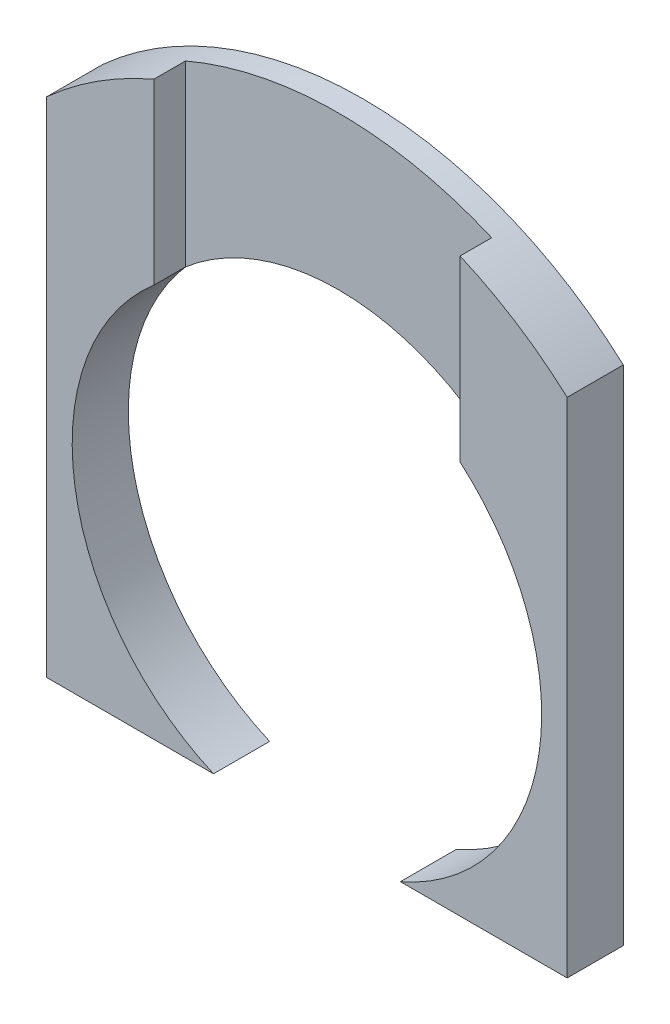
ISO-10303-21;
HEADER;
FILE_DESCRIPTION(('STEP AP214'),'2;1');
FILE_NAME('part.step','',(''),(''),'','','');
FILE_SCHEMA(('AUTOMOTIVE_DESIGN { 1 0 10303 214 1 1 1 1 }'));
ENDSEC;
DATA;
#1=APPLICATION_CONTEXT('core data for automotive mechanical design processes');
#2=APPLICATION_PROTOCOL_DEFINITION('international standard','automotive_design',2000,#1);
#3=PRODUCT_CONTEXT('',#1,'mechanical');
#4=PRODUCT('Part','Part','',(#3));
#5=PRODUCT_RELATED_PRODUCT_CATEGORY('part','',(#4));
#6=PRODUCT_DEFINITION_FORMATION('','',#4);
#7=PRODUCT_DEFINITION_CONTEXT('part definition',#1,'design');
#8=PRODUCT_DEFINITION('design','',#6,#7);
#9=PRODUCT_DEFINITION_SHAPE('','',#8);
#10=(LENGTH_UNIT() NAMED_UNIT(*) SI_UNIT(.MILLI.,.METRE.));
#11=(NAMED_UNIT(*) PLANE_ANGLE_UNIT() SI_UNIT($,.RADIAN.));
#12=(NAMED_UNIT(*) SI_UNIT($,.STERADIAN.) SOLID_ANGLE_UNIT());
#13=UNCERTAINTY_MEASURE_WITH_UNIT(LENGTH_MEASURE(1.E-05),#10,'distance_accuracy_value','');
#14=(GEOMETRIC_REPRESENTATION_CONTEXT(3) GLOBAL_UNCERTAINTY_ASSIGNED_CONTEXT((#13)) GLOBAL_UNIT_ASSIGNED_CONTEXT((#10,
#11,#12)) REPRESENTATION_CONTEXT('',''));
#15=CARTESIAN_POINT('',(0.,0.,0.));
#16=DIRECTION('',(0.,0.,1.));
#17=DIRECTION('',(1.,0.,0.));
#18=AXIS2_PLACEMENT_3D('',#15,#16,#17);
#19=CARTESIAN_POINT('',(0.,0.,32.85));
#20=DIRECTION('',(0.,0.,1.));
#21=DIRECTION('',(1.,0.,0.));
#22=AXIS2_PLACEMENT_3D('',#19,#20,#21);
#23=PLANE('',#22);
#24=CARTESIAN_POINT('',(0.,0.,32.85));
#25=DIRECTION('',(0.,0.,1.));
#26=DIRECTION('',(1.,0.,0.));
#27=AXIS2_PLACEMENT_3D('',#24,#25,#26);
#28=CIRCLE('',#27,11.5);
#29=CARTESIAN_POINT('',(-4.5768438907177,-10.55,32.85));
#30=VERTEX_POINT('',#29);
#31=CARTESIAN_POINT('',(-7.5,8.71779788708135,32.85));
#32=VERTEX_POINT('',#31);
#33=EDGE_CURVE('E141',#30,#32,#28,.F.);
#34=ORIENTED_EDGE('',*,*,#33,.T.);
#35=DIRECTION('',(0.,1.,0.));
#36=VECTOR('',#35,1.);
#37=CARTESIAN_POINT('',(-7.5,0.,32.85));
#38=LINE('',#37,#36);
#39=CARTESIAN_POINT('',(-7.5,17.4570902500961,32.85));
#40=VERTEX_POINT('',#39);
#41=EDGE_CURVE('E197',#32,#40,#38,.T.);
#42=ORIENTED_EDGE('',*,*,#41,.T.);
#43=CARTESIAN_POINT('',(0.,0.,32.85));
#44=DIRECTION('',(0.,0.,1.));
#45=DIRECTION('',(1.,0.,0.));
#46=AXIS2_PLACEMENT_3D('',#43,#44,#45);
#47=CIRCLE('',#46,19.);
#48=CARTESIAN_POINT('',(-12.75,14.0867845869808,32.85));
#49=VERTEX_POINT('',#48);
#50=EDGE_CURVE('E132',#40,#49,#47,.T.);
#51=ORIENTED_EDGE('',*,*,#50,.T.);
#52=DIRECTION('',(0.,-1.,0.));
#53=VECTOR('',#52,1.);
#54=CARTESIAN_POINT('',(-12.75,0.,32.85));
#55=LINE('',#54,#53);
#56=CARTESIAN_POINT('',(-12.75,-10.55,32.85));
#57=VERTEX_POINT('',#56);
#58=EDGE_CURVE('E177',#49,#57,#55,.T.);
#59=ORIENTED_EDGE('',*,*,#58,.T.);
#60=DIRECTION('',(1.,0.,0.));
#61=VECTOR('',#60,1.);
#62=CARTESIAN_POINT('',(0.,-10.55,32.85));
#63=LINE('',#62,#61);
#64=EDGE_CURVE('E193',#57,#30,#63,.T.);
#65=ORIENTED_EDGE('',*,*,#64,.T.);
#66=EDGE_LOOP('',(#34,#42,#51,#59,#65));
#67=FACE_BOUND('',#66,.T.);
#68=ADVANCED_FACE('F39',(#67),#23,.T.);
#69=CARTESIAN_POINT('',(12.75,14.0867845869808,32.85));
#70=VERTEX_POINT('',#69);
#71=CARTESIAN_POINT('',(7.5,17.4570902500961,32.85));
#72=VERTEX_POINT('',#71);
#73=EDGE_CURVE('E137',#70,#72,#47,.T.);
#74=ORIENTED_EDGE('',*,*,#73,.T.);
#75=DIRECTION('',(0.,-1.,0.));
#76=VECTOR('',#75,1.);
#77=CARTESIAN_POINT('',(7.5,0.,32.85));
#78=LINE('',#77,#76);
#79=CARTESIAN_POINT('',(7.5,8.71779788708135,32.85));
#80=VERTEX_POINT('',#79);
#81=EDGE_CURVE('E165',#72,#80,#78,.T.);
#82=ORIENTED_EDGE('',*,*,#81,.T.);
#83=CARTESIAN_POINT('',(4.5768438907177,-10.55,32.85));
#84=VERTEX_POINT('',#83);
#85=EDGE_CURVE('E151',#80,#84,#28,.F.);
#86=ORIENTED_EDGE('',*,*,#85,.T.);
#87=CARTESIAN_POINT('',(12.75,-10.55,32.85));
#88=VERTEX_POINT('',#87);
#89=EDGE_CURVE('E172',#84,#88,#63,.T.);
#90=ORIENTED_EDGE('',*,*,#89,.T.);
#91=DIRECTION('',(0.,1.,0.));
#92=VECTOR('',#91,1.);
#93=CARTESIAN_POINT('',(12.75,0.,32.85));
#94=LINE('',#93,#92);
#95=EDGE_CURVE('E155',#88,#70,#94,.T.);
#96=ORIENTED_EDGE('',*,*,#95,.T.);
#97=EDGE_LOOP('',(#74,#82,#86,#90,#96));
#98=FACE_BOUND('',#97,.T.);
#99=ADVANCED_FACE('F167',(#98),#23,.T.);
#100=CARTESIAN_POINT('',(0.,0.,32.95));
#101=DIRECTION('',(0.,0.,-1.));
#102=DIRECTION('',(-1.,0.,0.));
#103=AXIS2_PLACEMENT_3D('',#100,#101,#102);
#104=CYLINDRICAL_SURFACE('',#103,11.5);
#105=CARTESIAN_POINT('',(0.,0.,31.3));
#106=DIRECTION('',(0.,0.,1.));
#107=DIRECTION('',(1.,0.,0.));
#108=AXIS2_PLACEMENT_3D('',#105,#106,#107);
#109=CIRCLE('',#108,11.5);
#110=CARTESIAN_POINT('',(7.5,8.71779788708135,31.3));
#111=VERTEX_POINT('',#110);
#112=CARTESIAN_POINT('',(-7.5,8.71779788708135,31.3));
#113=VERTEX_POINT('',#112);
#114=EDGE_CURVE('E205',#111,#113,#109,.T.);
#115=ORIENTED_EDGE('',*,*,#114,.T.);
#116=DIRECTION('',(0.,0.,-1.));
#117=VECTOR('',#116,1.);
#118=CARTESIAN_POINT('',(-7.5,8.71779788708135,32.95));
#119=LINE('',#118,#117);
#120=EDGE_CURVE('E126',#113,#32,#119,.F.);
#121=ORIENTED_EDGE('',*,*,#120,.T.);
#122=ORIENTED_EDGE('',*,*,#33,.F.);
#123=DIRECTION('',(0.,0.,-1.));
#124=VECTOR('',#123,1.);
#125=CARTESIAN_POINT('',(-4.5768438907177,-10.55,32.95));
#126=LINE('',#125,#124);
#127=CARTESIAN_POINT('',(-4.5768438907177,-10.55,30.1));
#128=VERTEX_POINT('',#127);
#129=EDGE_CURVE('E189',#30,#128,#126,.T.);
#130=ORIENTED_EDGE('',*,*,#129,.T.);
#131=CARTESIAN_POINT('',(0.,0.,30.1));
#132=DIRECTION('',(0.,0.,1.));
#133=DIRECTION('',(1.,0.,0.));
#134=AXIS2_PLACEMENT_3D('',#131,#132,#133);
#135=CIRCLE('',#134,11.5);
#136=CARTESIAN_POINT('',(4.5768438907177,-10.55,30.1));
#137=VERTEX_POINT('',#136);
#138=EDGE_CURVE('E146',#128,#137,#135,.F.);
#139=ORIENTED_EDGE('',*,*,#138,.T.);
#140=DIRECTION('',(0.,0.,-1.));
#141=VECTOR('',#140,1.);
#142=CARTESIAN_POINT('',(4.5768438907177,-10.55,32.95));
#143=LINE('',#142,#141);
#144=EDGE_CURVE('E181',#137,#84,#143,.F.);
#145=ORIENTED_EDGE('',*,*,#144,.T.);
#146=ORIENTED_EDGE('',*,*,#85,.F.);
#147=DIRECTION('',(0.,0.,-1.));
#148=VECTOR('',#147,1.);
#149=CARTESIAN_POINT('',(7.5,8.71779788708135,32.95));
#150=LINE('',#149,#148);
#151=EDGE_CURVE('E200',#80,#111,#150,.T.);
#152=ORIENTED_EDGE('',*,*,#151,.T.);
#153=EDGE_LOOP('',(#115,#121,#122,#130,#139,#145,#146,#152));
#154=FACE_BOUND('',#153,.T.);
#155=ADVANCED_FACE('F202',(#154),#104,.F.);
#156=CARTESIAN_POINT('',(0.,0.,32.85));
#157=DIRECTION('',(0.,0.,-1.));
#158=DIRECTION('',(-1.,0.,0.));
#159=AXIS2_PLACEMENT_3D('',#156,#157,#158);
#160=CYLINDRICAL_SURFACE('',#159,19.);
#161=DIRECTION('',(0.,0.,-1.));
#162=VECTOR('',#161,1.);
#163=CARTESIAN_POINT('',(-7.5,17.4570902500961,32.85));
#164=LINE('',#163,#162);
#165=CARTESIAN_POINT('',(-7.5,17.4570902500961,31.3));
#166=VERTEX_POINT('',#165);
#167=EDGE_CURVE('E11',#166,#40,#164,.F.);
#168=ORIENTED_EDGE('',*,*,#167,.F.);
#169=CARTESIAN_POINT('',(0.,0.,31.3));
#170=DIRECTION('',(0.,0.,1.));
#171=DIRECTION('',(1.,0.,0.));
#172=AXIS2_PLACEMENT_3D('',#169,#170,#171);
#173=CIRCLE('',#172,19.);
#174=CARTESIAN_POINT('',(7.5,17.4570902500961,31.3));
#175=VERTEX_POINT('',#174);
#176=EDGE_CURVE('E111',#175,#166,#173,.T.);
#177=ORIENTED_EDGE('',*,*,#176,.F.);
#178=DIRECTION('',(0.,0.,-1.));
#179=VECTOR('',#178,1.);
#180=CARTESIAN_POINT('',(7.5,17.4570902500961,32.85));
#181=LINE('',#180,#179);
#182=EDGE_CURVE('E50',#72,#175,#181,.T.);
#183=ORIENTED_EDGE('',*,*,#182,.F.);
#184=ORIENTED_EDGE('',*,*,#73,.F.);
#185=DIRECTION('',(0.,0.,-1.));
#186=VECTOR('',#185,1.);
#187=CARTESIAN_POINT('',(12.75,14.0867845869808,32.85));
#188=LINE('',#187,#186);
#189=CARTESIAN_POINT('',(12.75,14.0867845869808,30.1));
#190=VERTEX_POINT('',#189);
#191=EDGE_CURVE('E173',#190,#70,#188,.F.);
#192=ORIENTED_EDGE('',*,*,#191,.F.);
#193=CARTESIAN_POINT('',(0.,0.,30.1));
#194=DIRECTION('',(0.,0.,1.));
#195=DIRECTION('',(1.,0.,0.));
#196=AXIS2_PLACEMENT_3D('',#193,#194,#195);
#197=CIRCLE('',#196,19.);
#198=CARTESIAN_POINT('',(-12.75,14.0867845869808,30.1));
#199=VERTEX_POINT('',#198);
#200=EDGE_CURVE('E140',#190,#199,#197,.T.);
#201=ORIENTED_EDGE('',*,*,#200,.T.);
#202=DIRECTION('',(0.,0.,-1.));
#203=VECTOR('',#202,1.);
#204=CARTESIAN_POINT('',(-12.75,14.0867845869808,32.85));
#205=LINE('',#204,#203);
#206=EDGE_CURVE('E133',#49,#199,#205,.T.);
#207=ORIENTED_EDGE('',*,*,#206,.F.);
#208=ORIENTED_EDGE('',*,*,#50,.F.);
#209=EDGE_LOOP('',(#168,#177,#183,#184,#192,#201,#207,#208));
#210=FACE_BOUND('',#209,.T.);
#211=ADVANCED_FACE('F41',(#210),#160,.T.);
#212=CARTESIAN_POINT('',(0.,0.,30.1));
#213=DIRECTION('',(0.,0.,1.));
#214=DIRECTION('',(1.,0.,0.));
#215=AXIS2_PLACEMENT_3D('',#212,#213,#214);
#216=PLANE('',#215);
#217=DIRECTION('',(1.,0.,0.));
#218=VECTOR('',#217,1.);
#219=CARTESIAN_POINT('',(0.,-10.55,30.1));
#220=LINE('',#219,#218);
#221=CARTESIAN_POINT('',(-12.75,-10.55,30.1));
#222=VERTEX_POINT('',#221);
#223=EDGE_CURVE('E195',#222,#128,#220,.T.);
#224=ORIENTED_EDGE('',*,*,#223,.F.);
#225=DIRECTION('',(0.,-1.,0.));
#226=VECTOR('',#225,1.);
#227=CARTESIAN_POINT('',(-12.75,0.,30.1));
#228=LINE('',#227,#226);
#229=EDGE_CURVE('E152',#199,#222,#228,.T.);
#230=ORIENTED_EDGE('',*,*,#229,.F.);
#231=ORIENTED_EDGE('',*,*,#200,.F.);
#232=DIRECTION('',(0.,1.,0.));
#233=VECTOR('',#232,1.);
#234=CARTESIAN_POINT('',(12.75,0.,30.1));
#235=LINE('',#234,#233);
#236=CARTESIAN_POINT('',(12.75,-10.55,30.1));
#237=VERTEX_POINT('',#236);
#238=EDGE_CURVE('E142',#237,#190,#235,.T.);
#239=ORIENTED_EDGE('',*,*,#238,.F.);
#240=EDGE_CURVE('E62',#137,#237,#220,.T.);
#241=ORIENTED_EDGE('',*,*,#240,.F.);
#242=ORIENTED_EDGE('',*,*,#138,.F.);
#243=EDGE_LOOP('',(#224,#230,#231,#239,#241,#242));
#244=FACE_BOUND('',#243,.T.);
#245=ADVANCED_FACE('F215',(#244),#216,.F.);
#246=CARTESIAN_POINT('',(12.75,20.,32.95));
#247=DIRECTION('',(1.,0.,0.));
#248=DIRECTION('',(0.,0.,-1.));
#249=AXIS2_PLACEMENT_3D('',#246,#247,#248);
#250=PLANE('',#249);
#251=ORIENTED_EDGE('',*,*,#95,.F.);
#252=DIRECTION('',(0.,0.,-1.));
#253=VECTOR('',#252,1.);
#254=CARTESIAN_POINT('',(12.75,-10.55,32.95));
#255=LINE('',#254,#253);
#256=EDGE_CURVE('E186',#88,#237,#255,.T.);
#257=ORIENTED_EDGE('',*,*,#256,.T.);
#258=ORIENTED_EDGE('',*,*,#238,.T.);
#259=ORIENTED_EDGE('',*,*,#191,.T.);
#260=EDGE_LOOP('',(#251,#257,#258,#259));
#261=FACE_BOUND('',#260,.T.);
#262=ADVANCED_FACE('F175',(#261),#250,.T.);
#263=CARTESIAN_POINT('',(-12.75,-20.,32.95));
#264=DIRECTION('',(-1.,0.,0.));
#265=DIRECTION('',(0.,0.,1.));
#266=AXIS2_PLACEMENT_3D('',#263,#264,#265);
#267=PLANE('',#266);
#268=ORIENTED_EDGE('',*,*,#229,.T.);
#269=DIRECTION('',(0.,0.,1.));
#270=VECTOR('',#269,1.);
#271=CARTESIAN_POINT('',(-12.75,-10.55,32.95));
#272=LINE('',#271,#270);
#273=EDGE_CURVE('E124',#222,#57,#272,.T.);
#274=ORIENTED_EDGE('',*,*,#273,.T.);
#275=ORIENTED_EDGE('',*,*,#58,.F.);
#276=ORIENTED_EDGE('',*,*,#206,.T.);
#277=EDGE_LOOP('',(#268,#274,#275,#276));
#278=FACE_BOUND('',#277,.T.);
#279=ADVANCED_FACE('F214',(#278),#267,.T.);
#280=CARTESIAN_POINT('',(20.,-10.55,32.95));
#281=DIRECTION('',(0.,-1.,0.));
#282=DIRECTION('',(0.,0.,-1.));
#283=AXIS2_PLACEMENT_3D('',#280,#281,#282);
#284=PLANE('',#283);
#285=ORIENTED_EDGE('',*,*,#64,.F.);
#286=ORIENTED_EDGE('',*,*,#273,.F.);
#287=ORIENTED_EDGE('',*,*,#223,.T.);
#288=ORIENTED_EDGE('',*,*,#129,.F.);
#289=EDGE_LOOP('',(#285,#286,#287,#288));
#290=FACE_BOUND('',#289,.T.);
#291=ADVANCED_FACE('F216',(#290),#284,.T.);
#292=ORIENTED_EDGE('',*,*,#240,.T.);
#293=ORIENTED_EDGE('',*,*,#256,.F.);
#294=ORIENTED_EDGE('',*,*,#89,.F.);
#295=ORIENTED_EDGE('',*,*,#144,.F.);
#296=EDGE_LOOP('',(#292,#293,#294,#295));
#297=FACE_BOUND('',#296,.T.);
#298=ADVANCED_FACE('F217',(#297),#284,.T.);
#299=CARTESIAN_POINT('',(0.,0.,31.3));
#300=DIRECTION('',(0.,0.,1.));
#301=DIRECTION('',(1.,0.,0.));
#302=AXIS2_PLACEMENT_3D('',#299,#300,#301);
#303=PLANE('',#302);
#304=DIRECTION('',(0.,1.,0.));
#305=VECTOR('',#304,1.);
#306=CARTESIAN_POINT('',(7.5,8.1,31.3));
#307=LINE('',#306,#305);
#308=EDGE_CURVE('E53',#111,#175,#307,.T.);
#309=ORIENTED_EDGE('',*,*,#308,.T.);
#310=ORIENTED_EDGE('',*,*,#176,.T.);
#311=DIRECTION('',(0.,-1.,0.));
#312=VECTOR('',#311,1.);
#313=CARTESIAN_POINT('',(-7.5,20.,31.3));
#314=LINE('',#313,#312);
#315=EDGE_CURVE('E117',#166,#113,#314,.T.);
#316=ORIENTED_EDGE('',*,*,#315,.T.);
#317=ORIENTED_EDGE('',*,*,#114,.F.);
#318=EDGE_LOOP('',(#309,#310,#316,#317));
#319=FACE_BOUND('',#318,.T.);
#320=ADVANCED_FACE('F116',(#319),#303,.T.);
#321=CARTESIAN_POINT('',(-7.5,20.,32.95));
#322=DIRECTION('',(1.,0.,0.));
#323=DIRECTION('',(0.,0.,-1.));
#324=AXIS2_PLACEMENT_3D('',#321,#322,#323);
#325=PLANE('',#324);
#326=ORIENTED_EDGE('',*,*,#315,.F.);
#327=ORIENTED_EDGE('',*,*,#167,.T.);
#328=ORIENTED_EDGE('',*,*,#41,.F.);
#329=ORIENTED_EDGE('',*,*,#120,.F.);
#330=EDGE_LOOP('',(#326,#327,#328,#329));
#331=FACE_BOUND('',#330,.T.);
#332=ADVANCED_FACE('F121',(#331),#325,.T.);
#333=CARTESIAN_POINT('',(7.5,8.1,32.95));
#334=DIRECTION('',(-1.,0.,0.));
#335=DIRECTION('',(0.,0.,1.));
#336=AXIS2_PLACEMENT_3D('',#333,#334,#335);
#337=PLANE('',#336);
#338=ORIENTED_EDGE('',*,*,#81,.F.);
#339=ORIENTED_EDGE('',*,*,#182,.T.);
#340=ORIENTED_EDGE('',*,*,#308,.F.);
#341=ORIENTED_EDGE('',*,*,#151,.F.);
#342=EDGE_LOOP('',(#338,#339,#340,#341));
#343=FACE_BOUND('',#342,.T.);
#344=ADVANCED_FACE('F157',(#343),#337,.T.);
#345=CLOSED_SHELL('',(#68,#99,#155,#211,#245,#262,#279,#291,#298,#320,#332,#344));
#346=MANIFOLD_SOLID_BREP('B2',#345);
#347=ADVANCED_BREP_SHAPE_REPRESENTATION('',(#18,#346),#14);
#348=SHAPE_DEFINITION_REPRESENTATION(#9,#347);
ENDSEC;
END-ISO-10303-21;
